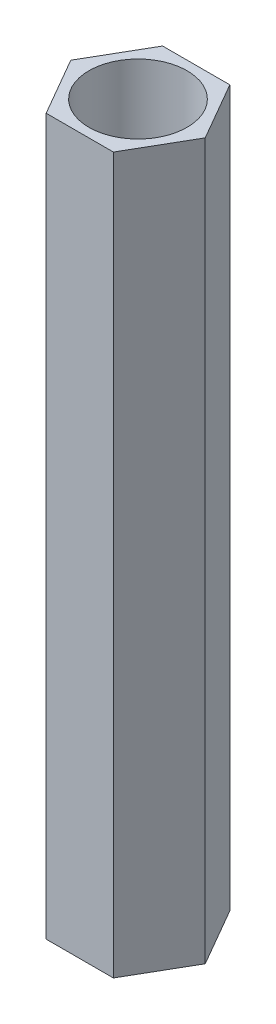
ISO-10303-21;
HEADER;
FILE_DESCRIPTION(('STEP AP214'),'2;1');
FILE_NAME('part.step','',(''),(''),'','','');
FILE_SCHEMA(('AUTOMOTIVE_DESIGN { 1 0 10303 214 1 1 1 1 }'));
ENDSEC;
DATA;
#1=APPLICATION_CONTEXT('core data for automotive mechanical design processes');
#2=APPLICATION_PROTOCOL_DEFINITION('international standard','automotive_design',2000,#1);
#3=PRODUCT_CONTEXT('',#1,'mechanical');
#4=PRODUCT('Part','Part','',(#3));
#5=PRODUCT_RELATED_PRODUCT_CATEGORY('part','',(#4));
#6=PRODUCT_DEFINITION_FORMATION('','',#4);
#7=PRODUCT_DEFINITION_CONTEXT('part definition',#1,'design');
#8=PRODUCT_DEFINITION('design','',#6,#7);
#9=PRODUCT_DEFINITION_SHAPE('','',#8);
#10=(LENGTH_UNIT() NAMED_UNIT(*) SI_UNIT(.MILLI.,.METRE.));
#11=(NAMED_UNIT(*) PLANE_ANGLE_UNIT() SI_UNIT($,.RADIAN.));
#12=(NAMED_UNIT(*) SI_UNIT($,.STERADIAN.) SOLID_ANGLE_UNIT());
#13=UNCERTAINTY_MEASURE_WITH_UNIT(LENGTH_MEASURE(1.E-05),#10,'distance_accuracy_value','');
#14=(GEOMETRIC_REPRESENTATION_CONTEXT(3) GLOBAL_UNCERTAINTY_ASSIGNED_CONTEXT((#13)) GLOBAL_UNIT_ASSIGNED_CONTEXT((#10,
#11,#12)) REPRESENTATION_CONTEXT('',''));
#15=CARTESIAN_POINT('',(0.,0.,0.));
#16=DIRECTION('',(0.,0.,1.));
#17=DIRECTION('',(1.,0.,0.));
#18=AXIS2_PLACEMENT_3D('',#15,#16,#17);
#19=CARTESIAN_POINT('',(0.,26.6,0.));
#20=DIRECTION('',(0.,1.,0.));
#21=DIRECTION('',(0.,0.,1.));
#22=AXIS2_PLACEMENT_3D('',#19,#20,#21);
#23=PLANE('',#22);
#24=DIRECTION('',(0.5,0.,-0.866025403784439));
#25=VECTOR('',#24,1.);
#26=CARTESIAN_POINT('',(1.25,26.6,2.1650635094611));
#27=LINE('',#26,#25);
#28=CARTESIAN_POINT('',(1.25,26.6,2.1650635094611));
#29=VERTEX_POINT('',#28);
#30=CARTESIAN_POINT('',(2.5,26.6,0.));
#31=VERTEX_POINT('',#30);
#32=EDGE_CURVE('E152',#29,#31,#27,.T.);
#33=ORIENTED_EDGE('',*,*,#32,.T.);
#34=DIRECTION('',(-0.5,0.,-0.866025403784439));
#35=VECTOR('',#34,1.);
#36=CARTESIAN_POINT('',(2.5,26.6,0.));
#37=LINE('',#36,#35);
#38=CARTESIAN_POINT('',(1.25,26.6,-2.1650635094611));
#39=VERTEX_POINT('',#38);
#40=EDGE_CURVE('E100',#31,#39,#37,.T.);
#41=ORIENTED_EDGE('',*,*,#40,.T.);
#42=DIRECTION('',(-1.,0.,0.));
#43=VECTOR('',#42,1.);
#44=CARTESIAN_POINT('',(1.25,26.6,-2.1650635094611));
#45=LINE('',#44,#43);
#46=CARTESIAN_POINT('',(-1.25,26.6,-2.1650635094611));
#47=VERTEX_POINT('',#46);
#48=EDGE_CURVE('E113',#39,#47,#45,.T.);
#49=ORIENTED_EDGE('',*,*,#48,.T.);
#50=DIRECTION('',(-0.5,0.,0.866025403784439));
#51=VECTOR('',#50,1.);
#52=CARTESIAN_POINT('',(-1.25,26.6,-2.1650635094611));
#53=LINE('',#52,#51);
#54=CARTESIAN_POINT('',(-2.5,26.6,0.));
#55=VERTEX_POINT('',#54);
#56=EDGE_CURVE('E107',#47,#55,#53,.T.);
#57=ORIENTED_EDGE('',*,*,#56,.T.);
#58=DIRECTION('',(0.5,0.,0.866025403784439));
#59=VECTOR('',#58,1.);
#60=CARTESIAN_POINT('',(-2.5,26.6,0.));
#61=LINE('',#60,#59);
#62=CARTESIAN_POINT('',(-1.25,26.6,2.1650635094611));
#63=VERTEX_POINT('',#62);
#64=EDGE_CURVE('E111',#55,#63,#61,.T.);
#65=ORIENTED_EDGE('',*,*,#64,.T.);
#66=DIRECTION('',(1.,0.,0.));
#67=VECTOR('',#66,1.);
#68=CARTESIAN_POINT('',(-1.25,26.6,2.1650635094611));
#69=LINE('',#68,#67);
#70=EDGE_CURVE('E63',#63,#29,#69,.T.);
#71=ORIENTED_EDGE('',*,*,#70,.T.);
#72=EDGE_LOOP('',(#33,#41,#49,#57,#65,#71));
#73=FACE_BOUND('',#72,.T.);
#74=CARTESIAN_POINT('',(0.,26.6,0.));
#75=DIRECTION('',(0.,1.,0.));
#76=DIRECTION('',(0.,0.,1.));
#77=AXIS2_PLACEMENT_3D('',#74,#75,#76);
#78=CIRCLE('',#77,1.825);
#79=CARTESIAN_POINT('',(0.,26.6,1.825));
#80=VERTEX_POINT('',#79);
#81=EDGE_CURVE('E140',#80,#80,#78,.T.);
#82=ORIENTED_EDGE('',*,*,#81,.F.);
#83=EDGE_LOOP('',(#82));
#84=FACE_BOUND('',#83,.T.);
#85=ADVANCED_FACE('F45',(#73,#84),#23,.T.);
#86=CARTESIAN_POINT('',(0.,0.,0.));
#87=DIRECTION('',(0.,1.,0.));
#88=DIRECTION('',(0.,0.,1.));
#89=AXIS2_PLACEMENT_3D('',#86,#87,#88);
#90=PLANE('',#89);
#91=DIRECTION('',(0.5,0.,-0.866025403784439));
#92=VECTOR('',#91,1.);
#93=CARTESIAN_POINT('',(1.25,0.,2.1650635094611));
#94=LINE('',#93,#92);
#95=CARTESIAN_POINT('',(1.25,0.,2.1650635094611));
#96=VERTEX_POINT('',#95);
#97=CARTESIAN_POINT('',(2.5,0.,0.));
#98=VERTEX_POINT('',#97);
#99=EDGE_CURVE('E135',#96,#98,#94,.T.);
#100=ORIENTED_EDGE('',*,*,#99,.F.);
#101=DIRECTION('',(1.,0.,0.));
#102=VECTOR('',#101,1.);
#103=CARTESIAN_POINT('',(-1.25,0.,2.1650635094611));
#104=LINE('',#103,#102);
#105=CARTESIAN_POINT('',(-1.25,0.,2.1650635094611));
#106=VERTEX_POINT('',#105);
#107=EDGE_CURVE('E92',#106,#96,#104,.T.);
#108=ORIENTED_EDGE('',*,*,#107,.F.);
#109=DIRECTION('',(0.5,0.,0.866025403784439));
#110=VECTOR('',#109,1.);
#111=CARTESIAN_POINT('',(-2.5,0.,0.));
#112=LINE('',#111,#110);
#113=CARTESIAN_POINT('',(-2.5,0.,0.));
#114=VERTEX_POINT('',#113);
#115=EDGE_CURVE('E86',#114,#106,#112,.T.);
#116=ORIENTED_EDGE('',*,*,#115,.F.);
#117=DIRECTION('',(-0.5,0.,0.866025403784439));
#118=VECTOR('',#117,1.);
#119=CARTESIAN_POINT('',(-1.25,0.,-2.1650635094611));
#120=LINE('',#119,#118);
#121=CARTESIAN_POINT('',(-1.25,0.,-2.1650635094611));
#122=VERTEX_POINT('',#121);
#123=EDGE_CURVE('E122',#122,#114,#120,.T.);
#124=ORIENTED_EDGE('',*,*,#123,.F.);
#125=DIRECTION('',(-1.,0.,0.));
#126=VECTOR('',#125,1.);
#127=CARTESIAN_POINT('',(1.25,0.,-2.1650635094611));
#128=LINE('',#127,#126);
#129=CARTESIAN_POINT('',(1.25,0.,-2.1650635094611));
#130=VERTEX_POINT('',#129);
#131=EDGE_CURVE('E143',#130,#122,#128,.T.);
#132=ORIENTED_EDGE('',*,*,#131,.F.);
#133=DIRECTION('',(-0.5,0.,-0.866025403784439));
#134=VECTOR('',#133,1.);
#135=CARTESIAN_POINT('',(2.5,0.,0.));
#136=LINE('',#135,#134);
#137=EDGE_CURVE('E139',#98,#130,#136,.T.);
#138=ORIENTED_EDGE('',*,*,#137,.F.);
#139=EDGE_LOOP('',(#100,#108,#116,#124,#132,#138));
#140=FACE_BOUND('',#139,.T.);
#141=CARTESIAN_POINT('',(0.,0.,0.));
#142=DIRECTION('',(0.,1.,0.));
#143=DIRECTION('',(0.,0.,1.));
#144=AXIS2_PLACEMENT_3D('',#141,#142,#143);
#145=CIRCLE('',#144,1.825);
#146=CARTESIAN_POINT('',(0.,0.,1.825));
#147=VERTEX_POINT('',#146);
#148=EDGE_CURVE('E249',#147,#147,#145,.T.);
#149=ORIENTED_EDGE('',*,*,#148,.T.);
#150=EDGE_LOOP('',(#149));
#151=FACE_BOUND('',#150,.T.);
#152=ADVANCED_FACE('F165',(#140,#151),#90,.F.);
#153=CARTESIAN_POINT('',(1.25,26.6,2.1650635094611));
#154=DIRECTION('',(-0.866025403784439,0.,-0.5));
#155=DIRECTION('',(-0.5,0.,0.866025403784439));
#156=AXIS2_PLACEMENT_3D('',#153,#154,#155);
#157=PLANE('',#156);
#158=ORIENTED_EDGE('',*,*,#99,.T.);
#159=DIRECTION('',(0.,-1.,0.));
#160=VECTOR('',#159,1.);
#161=CARTESIAN_POINT('',(2.5,26.6,0.));
#162=LINE('',#161,#160);
#163=EDGE_CURVE('E11',#31,#98,#162,.T.);
#164=ORIENTED_EDGE('',*,*,#163,.F.);
#165=ORIENTED_EDGE('',*,*,#32,.F.);
#166=DIRECTION('',(0.,-1.,0.));
#167=VECTOR('',#166,1.);
#168=CARTESIAN_POINT('',(1.25,26.6,2.1650635094611));
#169=LINE('',#168,#167);
#170=EDGE_CURVE('E131',#29,#96,#169,.T.);
#171=ORIENTED_EDGE('',*,*,#170,.T.);
#172=EDGE_LOOP('',(#158,#164,#165,#171));
#173=FACE_BOUND('',#172,.T.);
#174=ADVANCED_FACE('F47',(#173),#157,.F.);
#175=CARTESIAN_POINT('',(2.5,26.6,0.));
#176=DIRECTION('',(-0.866025403784439,0.,0.5));
#177=DIRECTION('',(0.5,0.,0.866025403784439));
#178=AXIS2_PLACEMENT_3D('',#175,#176,#177);
#179=PLANE('',#178);
#180=ORIENTED_EDGE('',*,*,#137,.T.);
#181=DIRECTION('',(0.,-1.,0.));
#182=VECTOR('',#181,1.);
#183=CARTESIAN_POINT('',(1.25,26.6,-2.1650635094611));
#184=LINE('',#183,#182);
#185=EDGE_CURVE('E55',#39,#130,#184,.T.);
#186=ORIENTED_EDGE('',*,*,#185,.F.);
#187=ORIENTED_EDGE('',*,*,#40,.F.);
#188=ORIENTED_EDGE('',*,*,#163,.T.);
#189=EDGE_LOOP('',(#180,#186,#187,#188));
#190=FACE_BOUND('',#189,.T.);
#191=ADVANCED_FACE('F190',(#190),#179,.F.);
#192=CARTESIAN_POINT('',(1.25,26.6,-2.1650635094611));
#193=DIRECTION('',(0.,0.,1.));
#194=DIRECTION('',(1.,0.,0.));
#195=AXIS2_PLACEMENT_3D('',#192,#193,#194);
#196=PLANE('',#195);
#197=ORIENTED_EDGE('',*,*,#131,.T.);
#198=DIRECTION('',(0.,-1.,0.));
#199=VECTOR('',#198,1.);
#200=CARTESIAN_POINT('',(-1.25,26.6,-2.1650635094611));
#201=LINE('',#200,#199);
#202=EDGE_CURVE('E124',#47,#122,#201,.T.);
#203=ORIENTED_EDGE('',*,*,#202,.F.);
#204=ORIENTED_EDGE('',*,*,#48,.F.);
#205=ORIENTED_EDGE('',*,*,#185,.T.);
#206=EDGE_LOOP('',(#197,#203,#204,#205));
#207=FACE_BOUND('',#206,.T.);
#208=ADVANCED_FACE('F162',(#207),#196,.F.);
#209=CARTESIAN_POINT('',(-1.25,26.6,-2.1650635094611));
#210=DIRECTION('',(0.866025403784439,0.,0.5));
#211=DIRECTION('',(0.5,0.,-0.866025403784439));
#212=AXIS2_PLACEMENT_3D('',#209,#210,#211);
#213=PLANE('',#212);
#214=ORIENTED_EDGE('',*,*,#123,.T.);
#215=DIRECTION('',(0.,-1.,0.));
#216=VECTOR('',#215,1.);
#217=CARTESIAN_POINT('',(-2.5,26.6,0.));
#218=LINE('',#217,#216);
#219=EDGE_CURVE('E119',#55,#114,#218,.T.);
#220=ORIENTED_EDGE('',*,*,#219,.F.);
#221=ORIENTED_EDGE('',*,*,#56,.F.);
#222=ORIENTED_EDGE('',*,*,#202,.T.);
#223=EDGE_LOOP('',(#214,#220,#221,#222));
#224=FACE_BOUND('',#223,.T.);
#225=ADVANCED_FACE('F120',(#224),#213,.F.);
#226=CARTESIAN_POINT('',(-2.5,26.6,0.));
#227=DIRECTION('',(0.866025403784439,0.,-0.5));
#228=DIRECTION('',(-0.5,0.,-0.866025403784439));
#229=AXIS2_PLACEMENT_3D('',#226,#227,#228);
#230=PLANE('',#229);
#231=ORIENTED_EDGE('',*,*,#115,.T.);
#232=DIRECTION('',(0.,-1.,0.));
#233=VECTOR('',#232,1.);
#234=CARTESIAN_POINT('',(-1.25,26.6,2.1650635094611));
#235=LINE('',#234,#233);
#236=EDGE_CURVE('E125',#63,#106,#235,.T.);
#237=ORIENTED_EDGE('',*,*,#236,.F.);
#238=ORIENTED_EDGE('',*,*,#64,.F.);
#239=ORIENTED_EDGE('',*,*,#219,.T.);
#240=EDGE_LOOP('',(#231,#237,#238,#239));
#241=FACE_BOUND('',#240,.T.);
#242=ADVANCED_FACE('F127',(#241),#230,.F.);
#243=CARTESIAN_POINT('',(-1.25,26.6,2.1650635094611));
#244=DIRECTION('',(0.,0.,-1.));
#245=DIRECTION('',(-1.,0.,0.));
#246=AXIS2_PLACEMENT_3D('',#243,#244,#245);
#247=PLANE('',#246);
#248=ORIENTED_EDGE('',*,*,#107,.T.);
#249=ORIENTED_EDGE('',*,*,#170,.F.);
#250=ORIENTED_EDGE('',*,*,#70,.F.);
#251=ORIENTED_EDGE('',*,*,#236,.T.);
#252=EDGE_LOOP('',(#248,#249,#250,#251));
#253=FACE_BOUND('',#252,.T.);
#254=ADVANCED_FACE('F170',(#253),#247,.F.);
#255=CARTESIAN_POINT('',(0.,26.6,0.));
#256=DIRECTION('',(0.,-1.,0.));
#257=DIRECTION('',(0.,0.,-1.));
#258=AXIS2_PLACEMENT_3D('',#255,#256,#257);
#259=CYLINDRICAL_SURFACE('',#258,1.825);
#260=ORIENTED_EDGE('',*,*,#81,.T.);
#261=EDGE_LOOP('',(#260));
#262=FACE_BOUND('',#261,.T.);
#263=ORIENTED_EDGE('',*,*,#148,.F.);
#264=EDGE_LOOP('',(#263));
#265=FACE_BOUND('',#264,.T.);
#266=ADVANCED_FACE('F172',(#262,#265),#259,.F.);
#267=CLOSED_SHELL('',(#85,#152,#174,#191,#208,#225,#242,#254,#266));
#268=MANIFOLD_SOLID_BREP('B2',#267);
#269=ADVANCED_BREP_SHAPE_REPRESENTATION('',(#18,#268),#14);
#270=SHAPE_DEFINITION_REPRESENTATION(#9,#269);
ENDSEC;
END-ISO-10303-21;
